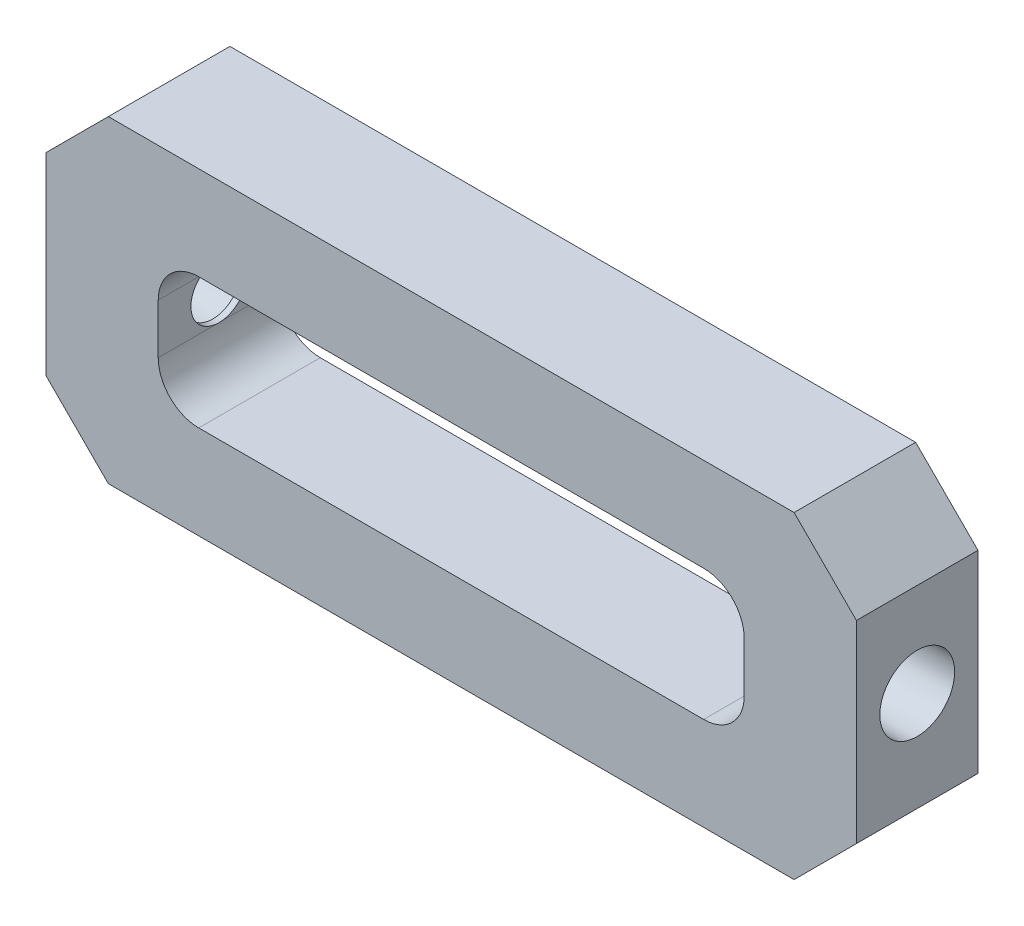
ISO-10303-21;
HEADER;
FILE_DESCRIPTION(('STEP AP214'),'2;1');
FILE_NAME('part.step','',(''),(''),'','','');
FILE_SCHEMA(('AUTOMOTIVE_DESIGN { 1 0 10303 214 1 1 1 1 }'));
ENDSEC;
DATA;
#1=APPLICATION_CONTEXT('core data for automotive mechanical design processes');
#2=APPLICATION_PROTOCOL_DEFINITION('international standard','automotive_design',2000,#1);
#3=PRODUCT_CONTEXT('',#1,'mechanical');
#4=PRODUCT('Part','Part','',(#3));
#5=PRODUCT_RELATED_PRODUCT_CATEGORY('part','',(#4));
#6=PRODUCT_DEFINITION_FORMATION('','',#4);
#7=PRODUCT_DEFINITION_CONTEXT('part definition',#1,'design');
#8=PRODUCT_DEFINITION('design','',#6,#7);
#9=PRODUCT_DEFINITION_SHAPE('','',#8);
#10=(LENGTH_UNIT() NAMED_UNIT(*) SI_UNIT(.MILLI.,.METRE.));
#11=(NAMED_UNIT(*) PLANE_ANGLE_UNIT() SI_UNIT($,.RADIAN.));
#12=(NAMED_UNIT(*) SI_UNIT($,.STERADIAN.) SOLID_ANGLE_UNIT());
#13=UNCERTAINTY_MEASURE_WITH_UNIT(LENGTH_MEASURE(1.E-05),#10,'distance_accuracy_value','');
#14=(GEOMETRIC_REPRESENTATION_CONTEXT(3) GLOBAL_UNCERTAINTY_ASSIGNED_CONTEXT((#13)) GLOBAL_UNIT_ASSIGNED_CONTEXT((#10,
#11,#12)) REPRESENTATION_CONTEXT('',''));
#15=CARTESIAN_POINT('',(0.,0.,0.));
#16=DIRECTION('',(0.,0.,1.));
#17=DIRECTION('',(1.,0.,0.));
#18=AXIS2_PLACEMENT_3D('',#15,#16,#17);
#19=CARTESIAN_POINT('',(130.,26.,9.75));
#20=DIRECTION('',(-1.,0.,0.));
#21=DIRECTION('',(0.,0.,1.));
#22=AXIS2_PLACEMENT_3D('',#19,#20,#21);
#23=CYLINDRICAL_SURFACE('',#22,4.5);
#24=CARTESIAN_POINT('',(112.,26.,9.75));
#25=DIRECTION('',(-1.,0.,0.));
#26=DIRECTION('',(0.,0.,1.));
#27=AXIS2_PLACEMENT_3D('',#24,#25,#26);
#28=CIRCLE('',#27,4.5);
#29=CARTESIAN_POINT('',(112.,29.5,6.92157287525381));
#30=VERTEX_POINT('',#29);
#31=CARTESIAN_POINT('',(112.,21.5,9.75));
#32=VERTEX_POINT('',#31);
#33=EDGE_CURVE('E326',#30,#32,#28,.T.);
#34=ORIENTED_EDGE('',*,*,#33,.T.);
#35=CARTESIAN_POINT('',(112.,29.5,12.5784271247462));
#36=VERTEX_POINT('',#35);
#37=EDGE_CURVE('E52',#32,#36,#28,.T.);
#38=ORIENTED_EDGE('',*,*,#37,.T.);
#39=CARTESIAN_POINT('',(112.,29.5,12.5784271247462));
#40=CARTESIAN_POINT('',(111.999991765271,29.5793480522933,12.4802609025094));
#41=CARTESIAN_POINT('',(111.998546501621,29.6545325897708,12.3787542444012));
#42=CARTESIAN_POINT('',(111.993641348599,29.7960835138657,12.1698415693693));
#43=CARTESIAN_POINT('',(111.990181874093,29.86245171292,12.0624367714046));
#44=CARTESIAN_POINT('',(111.982106767203,29.9859157819173,11.8424613735371));
#45=CARTESIAN_POINT('',(111.977491062238,30.0430110693938,11.7298904496996));
#46=CARTESIAN_POINT('',(111.967877834747,30.1475451558635,11.5003627214344));
#47=CARTESIAN_POINT('',(111.962880299963,30.1949836446903,11.383405776275));
#48=CARTESIAN_POINT('',(111.953186340534,30.2798799213596,11.1458990180754));
#49=CARTESIAN_POINT('',(111.948489943927,30.3173367808934,11.0253488720197));
#50=CARTESIAN_POINT('',(111.93996446048,30.3819992865734,10.7815000578609));
#51=CARTESIAN_POINT('',(111.936135363277,30.4092050552008,10.6582014226157));
#52=CARTESIAN_POINT('',(111.929774513598,30.4531491105912,10.4098160038804));
#53=CARTESIAN_POINT('',(111.927241769269,30.4698954021726,10.2847306629682));
#54=CARTESIAN_POINT('',(111.923739672502,30.4928261736446,10.033573653521));
#55=CARTESIAN_POINT('',(111.92277031047,30.499010718352,9.90750199104367));
#56=CARTESIAN_POINT('',(111.922496746255,30.5007678298603,9.65563441934543));
#57=CARTESIAN_POINT('',(111.923187912835,30.4963699112345,9.52983872032192));
#58=CARTESIAN_POINT('',(111.92615384106,30.4770576888269,9.279077271431));
#59=CARTESIAN_POINT('',(111.928428596322,30.4621434274301,9.15411151822064));
#60=CARTESIAN_POINT('',(111.934323779114,30.4218951409345,8.90579864913271));
#61=CARTESIAN_POINT('',(111.937945293265,30.3965527001796,8.7824529237898));
#62=CARTESIAN_POINT('',(111.946135168851,30.3356339670998,8.53834630347584));
#63=CARTESIAN_POINT('',(111.950703558956,30.3000573648869,8.41758548689424));
#64=CARTESIAN_POINT('',(111.960472569934,30.2170235996231,8.17391555679149));
#65=CARTESIAN_POINT('',(111.965692756131,30.1690890654669,8.05116963068393));
#66=CARTESIAN_POINT('',(111.975823377588,30.0626414924752,7.81034002006735));
#67=CARTESIAN_POINT('',(111.980733808297,30.0041282982344,7.6922564040808));
#68=CARTESIAN_POINT('',(111.989375845195,29.8769253786028,7.46159668903291));
#69=CARTESIAN_POINT('',(111.993107026541,29.8082319987049,7.3490225871752));
#70=CARTESIAN_POINT('',(111.998414272937,29.6612084587607,7.1302743477797));
#71=CARTESIAN_POINT('',(111.999989950695,29.5828765696692,7.02410136363859));
#72=CARTESIAN_POINT('',(112.,29.5,6.92157287525381));
#73=B_SPLINE_CURVE_WITH_KNOTS('',3,(#39,#40,#41,#42,#43,#44,#45,#46,#47,#48,#49,#50,#51,#52,#53,
#54,#55,#56,#57,#58,#59,#60,#61,#62,#63,#64,#65,#66,#67,#68,#69,#70,#71,#72),.UNSPECIFIED.,.F.,
.F.,(4,2,2,2,2,2,2,2,2,2,2,2,2,2,2,2,4),(0.,0.378527917309161,0.75697789714145,1.13545163965585,
1.5139375364342,1.89245862077817,2.27097518237082,2.64920170259913,3.02742590166147,
3.40459645370172,3.78176548560303,4.15923949590161,4.53672493723316,4.93184501737969,
5.32697090248861,5.72223897596385,6.11757805995332),.UNSPECIFIED.);
#74=EDGE_CURVE('E183',#36,#30,#73,.T.);
#75=ORIENTED_EDGE('',*,*,#74,.T.);
#76=EDGE_LOOP('',(#34,#38,#75));
#77=FACE_BOUND('',#76,.T.);
#78=CARTESIAN_POINT('',(120.,26.,9.75));
#79=DIRECTION('',(1.,0.,0.));
#80=DIRECTION('',(0.,0.,-1.));
#81=AXIS2_PLACEMENT_3D('',#78,#79,#80);
#82=CIRCLE('',#81,4.5);
#83=CARTESIAN_POINT('',(120.,26.,5.25));
#84=VERTEX_POINT('',#83);
#85=EDGE_CURVE('E39',#84,#84,#82,.F.);
#86=ORIENTED_EDGE('',*,*,#85,.F.);
#87=EDGE_LOOP('',(#86));
#88=FACE_BOUND('',#87,.T.);
#89=ADVANCED_FACE('F35',(#77,#88),#23,.F.);
#90=CARTESIAN_POINT('',(18.,29.5,6.92157287525381));
#91=CARTESIAN_POINT('',(18.000008234729,29.5793480522933,7.01973909749057));
#92=CARTESIAN_POINT('',(18.0014534983789,29.6545325897708,7.12124575559876));
#93=CARTESIAN_POINT('',(18.0063586514006,29.7960835138657,7.33015843063067));
#94=CARTESIAN_POINT('',(18.0098181259073,29.86245171292,7.43756322859537));
#95=CARTESIAN_POINT('',(18.0178932327974,29.9859157819173,7.65753862646291));
#96=CARTESIAN_POINT('',(18.0225089377619,30.0430110693938,7.77010955030039));
#97=CARTESIAN_POINT('',(18.0321221652533,30.1475451558635,7.99963727856562));
#98=CARTESIAN_POINT('',(18.0371197000371,30.1949836446903,8.11659422372496));
#99=CARTESIAN_POINT('',(18.0468136594657,30.2798799213596,8.35410098192457));
#100=CARTESIAN_POINT('',(18.0515100560731,30.3173367808934,8.47465112798033));
#101=CARTESIAN_POINT('',(18.0600355395204,30.3819992865734,8.71849994213914));
#102=CARTESIAN_POINT('',(18.0638646367226,30.4092050552008,8.84179857738433));
#103=CARTESIAN_POINT('',(18.0702254864016,30.4531491105912,9.09018399611962));
#104=CARTESIAN_POINT('',(18.072758230731,30.4698954021726,9.21526933703175));
#105=CARTESIAN_POINT('',(18.0762603274978,30.4928261736446,9.466426346479));
#106=CARTESIAN_POINT('',(18.0772296895296,30.499010718352,9.59249800895633));
#107=CARTESIAN_POINT('',(18.0775032537455,30.5007678298603,9.84436558065457));
#108=CARTESIAN_POINT('',(18.0768120871652,30.4963699112345,9.97016127967808));
#109=CARTESIAN_POINT('',(18.07384615894,30.4770576888269,10.220922728569));
#110=CARTESIAN_POINT('',(18.0715714036776,30.4621434274301,10.3458884817794));
#111=CARTESIAN_POINT('',(18.0656762208859,30.4218951409345,10.5942013508673));
#112=CARTESIAN_POINT('',(18.0620547067351,30.3965527001796,10.7175470762102));
#113=CARTESIAN_POINT('',(18.0538648311493,30.3356339670998,10.9616536965242));
#114=CARTESIAN_POINT('',(18.0492964410443,30.3000573648869,11.0824145131058));
#115=CARTESIAN_POINT('',(18.0395274300662,30.2170235996231,11.3260844432085));
#116=CARTESIAN_POINT('',(18.0343072438692,30.1690890654669,11.4488303693161));
#117=CARTESIAN_POINT('',(18.0241766224116,30.0626414924752,11.6896599799327));
#118=CARTESIAN_POINT('',(18.0192661917029,30.0041282982344,11.8077435959192));
#119=CARTESIAN_POINT('',(18.0106241548051,29.8769253786028,12.0384033109671));
#120=CARTESIAN_POINT('',(18.0068929734587,29.8082319987049,12.1509774128248));
#121=CARTESIAN_POINT('',(18.0015857270633,29.6612084587607,12.3697256522203));
#122=CARTESIAN_POINT('',(18.0000100493046,29.5828765696692,12.4758986363614));
#123=CARTESIAN_POINT('',(18.,29.5,12.5784271247462));
#124=B_SPLINE_CURVE_WITH_KNOTS('',3,(#90,#91,#92,#93,#94,#95,#96,#97,#98,#99,#100,#101,#102,
#103,#104,#105,#106,#107,#108,#109,#110,#111,#112,#113,#114,#115,#116,#117,#118,#119,#120,#121,
#122,#123),.UNSPECIFIED.,.F.,.F.,(4,2,2,2,2,2,2,2,2,2,2,2,2,2,2,2,4),(0.,0.378527917309161,
0.756977897141452,1.13545163965585,1.5139375364342,1.89245862077817,2.27097518237082,
2.64920170259913,3.02742590166147,3.40459645370172,3.78176548560303,4.1592394959016,
4.53672493723316,4.93184501737969,5.32697090248861,5.72223897596385,6.11757805995332),.UNSPECIFIED.);
#125=CARTESIAN_POINT('',(18.,29.5,6.92157287525381));
#126=VERTEX_POINT('',#125);
#127=CARTESIAN_POINT('',(18.,29.5,12.5784271247462));
#128=VERTEX_POINT('',#127);
#129=EDGE_CURVE('E169',#126,#128,#124,.T.);
#130=ORIENTED_EDGE('',*,*,#129,.T.);
#131=CARTESIAN_POINT('',(18.,26.,9.75));
#132=DIRECTION('',(1.,0.,0.));
#133=DIRECTION('',(0.,0.,-1.));
#134=AXIS2_PLACEMENT_3D('',#131,#132,#133);
#135=CIRCLE('',#134,4.5);
#136=CARTESIAN_POINT('',(18.,21.5,9.75));
#137=VERTEX_POINT('',#136);
#138=EDGE_CURVE('E60',#128,#137,#135,.T.);
#139=ORIENTED_EDGE('',*,*,#138,.T.);
#140=EDGE_CURVE('E165',#137,#126,#135,.T.);
#141=ORIENTED_EDGE('',*,*,#140,.T.);
#142=EDGE_LOOP('',(#130,#139,#141));
#143=FACE_BOUND('',#142,.T.);
#144=CARTESIAN_POINT('',(17.,26.,9.75));
#145=DIRECTION('',(-1.,0.,0.));
#146=DIRECTION('',(0.,0.,1.));
#147=AXIS2_PLACEMENT_3D('',#144,#145,#146);
#148=CIRCLE('',#147,4.5);
#149=CARTESIAN_POINT('',(17.,26.,14.25));
#150=VERTEX_POINT('',#149);
#151=EDGE_CURVE('E173',#150,#150,#148,.F.);
#152=ORIENTED_EDGE('',*,*,#151,.F.);
#153=EDGE_LOOP('',(#152));
#154=FACE_BOUND('',#153,.T.);
#155=ADVANCED_FACE('F167',(#143,#154),#23,.F.);
#156=CARTESIAN_POINT('',(112.,29.5,19.5));
#157=DIRECTION('',(-1.,0.,0.));
#158=DIRECTION('',(0.,0.,1.));
#159=AXIS2_PLACEMENT_3D('',#156,#157,#158);
#160=PLANE('',#159);
#161=ORIENTED_EDGE('',*,*,#33,.F.);
#162=DIRECTION('',(0.,0.,-1.));
#163=VECTOR('',#162,1.);
#164=CARTESIAN_POINT('',(112.,29.5,19.5));
#165=LINE('',#164,#163);
#166=CARTESIAN_POINT('',(112.,29.5,0.));
#167=VERTEX_POINT('',#166);
#168=EDGE_CURVE('E200',#30,#167,#165,.T.);
#169=ORIENTED_EDGE('',*,*,#168,.T.);
#170=DIRECTION('',(0.,1.,0.));
#171=VECTOR('',#170,1.);
#172=CARTESIAN_POINT('',(112.,29.5,0.));
#173=LINE('',#172,#171);
#174=CARTESIAN_POINT('',(112.,21.5,0.));
#175=VERTEX_POINT('',#174);
#176=EDGE_CURVE('E442',#175,#167,#173,.T.);
#177=ORIENTED_EDGE('',*,*,#176,.F.);
#178=DIRECTION('',(0.,0.,-1.));
#179=VECTOR('',#178,1.);
#180=CARTESIAN_POINT('',(112.,21.5,19.5));
#181=LINE('',#180,#179);
#182=EDGE_CURVE('E204',#32,#175,#181,.T.);
#183=ORIENTED_EDGE('',*,*,#182,.F.);
#184=EDGE_LOOP('',(#161,#169,#177,#183));
#185=FACE_BOUND('',#184,.T.);
#186=ADVANCED_FACE('F300',(#185),#160,.T.);
#187=CARTESIAN_POINT('',(18.,29.5,19.5));
#188=DIRECTION('',(1.,0.,0.));
#189=DIRECTION('',(0.,0.,-1.));
#190=AXIS2_PLACEMENT_3D('',#187,#188,#189);
#191=PLANE('',#190);
#192=ORIENTED_EDGE('',*,*,#138,.F.);
#193=DIRECTION('',(0.,0.,-1.));
#194=VECTOR('',#193,1.);
#195=CARTESIAN_POINT('',(18.,29.5,19.5));
#196=LINE('',#195,#194);
#197=CARTESIAN_POINT('',(18.,29.5,19.5));
#198=VERTEX_POINT('',#197);
#199=EDGE_CURVE('E182',#198,#128,#196,.T.);
#200=ORIENTED_EDGE('',*,*,#199,.F.);
#201=DIRECTION('',(0.,-1.,0.));
#202=VECTOR('',#201,1.);
#203=CARTESIAN_POINT('',(18.,29.5,19.5));
#204=LINE('',#203,#202);
#205=CARTESIAN_POINT('',(18.,21.5,19.5));
#206=VERTEX_POINT('',#205);
#207=EDGE_CURVE('E470',#198,#206,#204,.T.);
#208=ORIENTED_EDGE('',*,*,#207,.T.);
#209=DIRECTION('',(0.,0.,-1.));
#210=VECTOR('',#209,1.);
#211=CARTESIAN_POINT('',(18.,21.5,19.5));
#212=LINE('',#211,#210);
#213=EDGE_CURVE('E189',#206,#137,#212,.T.);
#214=ORIENTED_EDGE('',*,*,#213,.T.);
#215=EDGE_LOOP('',(#192,#200,#208,#214));
#216=FACE_BOUND('',#215,.T.);
#217=ADVANCED_FACE('F313',(#216),#191,.T.);
#218=CARTESIAN_POINT('',(0.,0.,19.5));
#219=DIRECTION('',(0.,0.,1.));
#220=DIRECTION('',(1.,0.,0.));
#221=AXIS2_PLACEMENT_3D('',#218,#219,#220);
#222=PLANE('',#221);
#223=DIRECTION('',(-0.707106781186547,-0.707106781186548,0.));
#224=VECTOR('',#223,1.);
#225=CARTESIAN_POINT('',(0.,41.,19.5));
#226=LINE('',#225,#224);
#227=CARTESIAN_POINT('',(10.,51.,19.5));
#228=VERTEX_POINT('',#227);
#229=CARTESIAN_POINT('',(0.,41.,19.5));
#230=VERTEX_POINT('',#229);
#231=EDGE_CURVE('E214',#228,#230,#226,.T.);
#232=ORIENTED_EDGE('',*,*,#231,.T.);
#233=DIRECTION('',(0.,-1.,0.));
#234=VECTOR('',#233,1.);
#235=CARTESIAN_POINT('',(0.,41.,19.5));
#236=LINE('',#235,#234);
#237=CARTESIAN_POINT('',(0.,10.,19.5));
#238=VERTEX_POINT('',#237);
#239=EDGE_CURVE('E217',#230,#238,#236,.T.);
#240=ORIENTED_EDGE('',*,*,#239,.T.);
#241=DIRECTION('',(0.707106781186548,-0.707106781186548,0.));
#242=VECTOR('',#241,1.);
#243=CARTESIAN_POINT('',(0.,10.,19.5));
#244=LINE('',#243,#242);
#245=CARTESIAN_POINT('',(10.,0.,19.5));
#246=VERTEX_POINT('',#245);
#247=EDGE_CURVE('E220',#238,#246,#244,.T.);
#248=ORIENTED_EDGE('',*,*,#247,.T.);
#249=DIRECTION('',(1.,0.,0.));
#250=VECTOR('',#249,1.);
#251=CARTESIAN_POINT('',(10.,0.,19.5));
#252=LINE('',#251,#250);
#253=CARTESIAN_POINT('',(120.,0.,19.5));
#254=VERTEX_POINT('',#253);
#255=EDGE_CURVE('E222',#246,#254,#252,.T.);
#256=ORIENTED_EDGE('',*,*,#255,.T.);
#257=DIRECTION('',(0.707106781186548,0.707106781186547,0.));
#258=VECTOR('',#257,1.);
#259=CARTESIAN_POINT('',(130.,10.,19.5));
#260=LINE('',#259,#258);
#261=CARTESIAN_POINT('',(130.,10.,19.5));
#262=VERTEX_POINT('',#261);
#263=EDGE_CURVE('E224',#254,#262,#260,.T.);
#264=ORIENTED_EDGE('',*,*,#263,.T.);
#265=DIRECTION('',(0.,1.,0.));
#266=VECTOR('',#265,1.);
#267=CARTESIAN_POINT('',(130.,41.,19.5));
#268=LINE('',#267,#266);
#269=CARTESIAN_POINT('',(130.,41.,19.5));
#270=VERTEX_POINT('',#269);
#271=EDGE_CURVE('E226',#262,#270,#268,.T.);
#272=ORIENTED_EDGE('',*,*,#271,.T.);
#273=DIRECTION('',(-0.707106781186548,0.707106781186547,0.));
#274=VECTOR('',#273,1.);
#275=CARTESIAN_POINT('',(130.,41.,19.5));
#276=LINE('',#275,#274);
#277=CARTESIAN_POINT('',(120.,51.,19.5));
#278=VERTEX_POINT('',#277);
#279=EDGE_CURVE('E228',#270,#278,#276,.T.);
#280=ORIENTED_EDGE('',*,*,#279,.T.);
#281=DIRECTION('',(-1.,0.,0.));
#282=VECTOR('',#281,1.);
#283=CARTESIAN_POINT('',(10.,51.,19.5));
#284=LINE('',#283,#282);
#285=EDGE_CURVE('E230',#278,#228,#284,.T.);
#286=ORIENTED_EDGE('',*,*,#285,.T.);
#287=EDGE_LOOP('',(#232,#240,#248,#256,#264,#272,#280,#286));
#288=FACE_BOUND('',#287,.T.);
#289=DIRECTION('',(1.,0.,0.));
#290=VECTOR('',#289,1.);
#291=CARTESIAN_POINT('',(24.5,15.,19.5));
#292=LINE('',#291,#290);
#293=CARTESIAN_POINT('',(24.5,15.,19.5));
#294=VERTEX_POINT('',#293);
#295=CARTESIAN_POINT('',(105.5,15.,19.5));
#296=VERTEX_POINT('',#295);
#297=EDGE_CURVE('E450',#294,#296,#292,.T.);
#298=ORIENTED_EDGE('',*,*,#297,.F.);
#299=CARTESIAN_POINT('',(24.5,21.5,19.5));
#300=DIRECTION('',(0.,0.,1.));
#301=DIRECTION('',(1.,0.,0.));
#302=AXIS2_PLACEMENT_3D('',#299,#300,#301);
#303=CIRCLE('',#302,6.5);
#304=EDGE_CURVE('E449',#206,#294,#303,.T.);
#305=ORIENTED_EDGE('',*,*,#304,.F.);
#306=ORIENTED_EDGE('',*,*,#207,.F.);
#307=CARTESIAN_POINT('',(24.5,29.5,19.5));
#308=DIRECTION('',(0.,0.,1.));
#309=DIRECTION('',(1.,0.,0.));
#310=AXIS2_PLACEMENT_3D('',#307,#308,#309);
#311=CIRCLE('',#310,6.5);
#312=CARTESIAN_POINT('',(24.5,36.,19.5));
#313=VERTEX_POINT('',#312);
#314=EDGE_CURVE('E468',#313,#198,#311,.T.);
#315=ORIENTED_EDGE('',*,*,#314,.F.);
#316=DIRECTION('',(-1.,0.,0.));
#317=VECTOR('',#316,1.);
#318=CARTESIAN_POINT('',(24.5,36.,19.5));
#319=LINE('',#318,#317);
#320=CARTESIAN_POINT('',(105.5,36.,19.5));
#321=VERTEX_POINT('',#320);
#322=EDGE_CURVE('E466',#321,#313,#319,.T.);
#323=ORIENTED_EDGE('',*,*,#322,.F.);
#324=CARTESIAN_POINT('',(105.5,29.5,19.5));
#325=DIRECTION('',(0.,0.,1.));
#326=DIRECTION('',(1.,0.,0.));
#327=AXIS2_PLACEMENT_3D('',#324,#325,#326);
#328=CIRCLE('',#327,6.5);
#329=CARTESIAN_POINT('',(112.,29.5,19.5));
#330=VERTEX_POINT('',#329);
#331=EDGE_CURVE('E464',#330,#321,#328,.T.);
#332=ORIENTED_EDGE('',*,*,#331,.F.);
#333=DIRECTION('',(0.,1.,0.));
#334=VECTOR('',#333,1.);
#335=CARTESIAN_POINT('',(112.,29.5,19.5));
#336=LINE('',#335,#334);
#337=CARTESIAN_POINT('',(112.,21.5,19.5));
#338=VERTEX_POINT('',#337);
#339=EDGE_CURVE('E462',#338,#330,#336,.T.);
#340=ORIENTED_EDGE('',*,*,#339,.F.);
#341=CARTESIAN_POINT('',(105.5,21.5,19.5));
#342=DIRECTION('',(0.,0.,1.));
#343=DIRECTION('',(1.,0.,0.));
#344=AXIS2_PLACEMENT_3D('',#341,#342,#343);
#345=CIRCLE('',#344,6.50000000000002);
#346=EDGE_CURVE('E455',#296,#338,#345,.T.);
#347=ORIENTED_EDGE('',*,*,#346,.F.);
#348=EDGE_LOOP('',(#298,#305,#306,#315,#323,#332,#340,#347));
#349=FACE_BOUND('',#348,.T.);
#350=ADVANCED_FACE('F319',(#288,#349),#222,.T.);
#351=CARTESIAN_POINT('',(0.,0.,0.));
#352=DIRECTION('',(0.,0.,1.));
#353=DIRECTION('',(1.,0.,0.));
#354=AXIS2_PLACEMENT_3D('',#351,#352,#353);
#355=PLANE('',#354);
#356=DIRECTION('',(-0.707106781186547,-0.707106781186548,0.));
#357=VECTOR('',#356,1.);
#358=CARTESIAN_POINT('',(0.,41.,0.));
#359=LINE('',#358,#357);
#360=CARTESIAN_POINT('',(10.,51.,0.));
#361=VERTEX_POINT('',#360);
#362=CARTESIAN_POINT('',(0.,41.,0.));
#363=VERTEX_POINT('',#362);
#364=EDGE_CURVE('E213',#361,#363,#359,.T.);
#365=ORIENTED_EDGE('',*,*,#364,.F.);
#366=DIRECTION('',(-1.,0.,0.));
#367=VECTOR('',#366,1.);
#368=CARTESIAN_POINT('',(10.,51.,0.));
#369=LINE('',#368,#367);
#370=CARTESIAN_POINT('',(120.,51.,0.));
#371=VERTEX_POINT('',#370);
#372=EDGE_CURVE('E218',#371,#361,#369,.T.);
#373=ORIENTED_EDGE('',*,*,#372,.F.);
#374=DIRECTION('',(-0.707106781186548,0.707106781186547,0.));
#375=VECTOR('',#374,1.);
#376=CARTESIAN_POINT('',(130.,41.,0.));
#377=LINE('',#376,#375);
#378=CARTESIAN_POINT('',(130.,41.,0.));
#379=VERTEX_POINT('',#378);
#380=EDGE_CURVE('E245',#379,#371,#377,.T.);
#381=ORIENTED_EDGE('',*,*,#380,.F.);
#382=DIRECTION('',(0.,1.,0.));
#383=VECTOR('',#382,1.);
#384=CARTESIAN_POINT('',(130.,41.,0.));
#385=LINE('',#384,#383);
#386=CARTESIAN_POINT('',(130.,10.,0.));
#387=VERTEX_POINT('',#386);
#388=EDGE_CURVE('E243',#387,#379,#385,.T.);
#389=ORIENTED_EDGE('',*,*,#388,.F.);
#390=DIRECTION('',(0.707106781186548,0.707106781186547,0.));
#391=VECTOR('',#390,1.);
#392=CARTESIAN_POINT('',(130.,10.,0.));
#393=LINE('',#392,#391);
#394=CARTESIAN_POINT('',(120.,0.,0.));
#395=VERTEX_POINT('',#394);
#396=EDGE_CURVE('E241',#395,#387,#393,.T.);
#397=ORIENTED_EDGE('',*,*,#396,.F.);
#398=DIRECTION('',(1.,0.,0.));
#399=VECTOR('',#398,1.);
#400=CARTESIAN_POINT('',(10.,0.,0.));
#401=LINE('',#400,#399);
#402=CARTESIAN_POINT('',(10.,0.,0.));
#403=VERTEX_POINT('',#402);
#404=EDGE_CURVE('E239',#403,#395,#401,.T.);
#405=ORIENTED_EDGE('',*,*,#404,.F.);
#406=DIRECTION('',(0.707106781186548,-0.707106781186548,0.));
#407=VECTOR('',#406,1.);
#408=CARTESIAN_POINT('',(0.,10.,0.));
#409=LINE('',#408,#407);
#410=CARTESIAN_POINT('',(0.,10.,0.));
#411=VERTEX_POINT('',#410);
#412=EDGE_CURVE('E237',#411,#403,#409,.T.);
#413=ORIENTED_EDGE('',*,*,#412,.F.);
#414=DIRECTION('',(0.,-1.,0.));
#415=VECTOR('',#414,1.);
#416=CARTESIAN_POINT('',(0.,41.,0.));
#417=LINE('',#416,#415);
#418=EDGE_CURVE('E235',#363,#411,#417,.T.);
#419=ORIENTED_EDGE('',*,*,#418,.F.);
#420=EDGE_LOOP('',(#365,#373,#381,#389,#397,#405,#413,#419));
#421=FACE_BOUND('',#420,.T.);
#422=CARTESIAN_POINT('',(24.5,21.5,0.));
#423=DIRECTION('',(0.,0.,1.));
#424=DIRECTION('',(1.,0.,0.));
#425=AXIS2_PLACEMENT_3D('',#422,#423,#424);
#426=CIRCLE('',#425,6.5);
#427=CARTESIAN_POINT('',(18.,21.5,0.));
#428=VERTEX_POINT('',#427);
#429=CARTESIAN_POINT('',(24.5,15.,0.));
#430=VERTEX_POINT('',#429);
#431=EDGE_CURVE('E472',#428,#430,#426,.T.);
#432=ORIENTED_EDGE('',*,*,#431,.T.);
#433=DIRECTION('',(1.,0.,0.));
#434=VECTOR('',#433,1.);
#435=CARTESIAN_POINT('',(24.5,15.,0.));
#436=LINE('',#435,#434);
#437=CARTESIAN_POINT('',(105.5,15.,0.));
#438=VERTEX_POINT('',#437);
#439=EDGE_CURVE('E474',#430,#438,#436,.T.);
#440=ORIENTED_EDGE('',*,*,#439,.T.);
#441=CARTESIAN_POINT('',(105.5,21.5,0.));
#442=DIRECTION('',(0.,0.,1.));
#443=DIRECTION('',(1.,0.,0.));
#444=AXIS2_PLACEMENT_3D('',#441,#442,#443);
#445=CIRCLE('',#444,6.50000000000002);
#446=EDGE_CURVE('E445',#438,#175,#445,.T.);
#447=ORIENTED_EDGE('',*,*,#446,.T.);
#448=ORIENTED_EDGE('',*,*,#176,.T.);
#449=CARTESIAN_POINT('',(105.5,29.5,0.));
#450=DIRECTION('',(0.,0.,1.));
#451=DIRECTION('',(1.,0.,0.));
#452=AXIS2_PLACEMENT_3D('',#449,#450,#451);
#453=CIRCLE('',#452,6.5);
#454=CARTESIAN_POINT('',(105.5,36.,0.));
#455=VERTEX_POINT('',#454);
#456=EDGE_CURVE('E435',#167,#455,#453,.T.);
#457=ORIENTED_EDGE('',*,*,#456,.T.);
#458=DIRECTION('',(-1.,0.,0.));
#459=VECTOR('',#458,1.);
#460=CARTESIAN_POINT('',(24.5,36.,0.));
#461=LINE('',#460,#459);
#462=CARTESIAN_POINT('',(24.5,36.,0.));
#463=VERTEX_POINT('',#462);
#464=EDGE_CURVE('E430',#455,#463,#461,.T.);
#465=ORIENTED_EDGE('',*,*,#464,.T.);
#466=CARTESIAN_POINT('',(24.5,29.5,0.));
#467=DIRECTION('',(0.,0.,1.));
#468=DIRECTION('',(1.,0.,0.));
#469=AXIS2_PLACEMENT_3D('',#466,#467,#468);
#470=CIRCLE('',#469,6.5);
#471=CARTESIAN_POINT('',(18.,29.5,0.));
#472=VERTEX_POINT('',#471);
#473=EDGE_CURVE('E434',#463,#472,#470,.T.);
#474=ORIENTED_EDGE('',*,*,#473,.T.);
#475=DIRECTION('',(0.,-1.,0.));
#476=VECTOR('',#475,1.);
#477=CARTESIAN_POINT('',(18.,29.5,0.));
#478=LINE('',#477,#476);
#479=EDGE_CURVE('E187',#472,#428,#478,.T.);
#480=ORIENTED_EDGE('',*,*,#479,.T.);
#481=EDGE_LOOP('',(#432,#440,#447,#448,#457,#465,#474,#480));
#482=FACE_BOUND('',#481,.T.);
#483=ADVANCED_FACE('F357',(#421,#482),#355,.F.);
#484=CARTESIAN_POINT('',(0.,41.,19.5));
#485=DIRECTION('',(0.707106781186548,-0.707106781186547,0.));
#486=DIRECTION('',(0.707106781186547,0.707106781186548,0.));
#487=AXIS2_PLACEMENT_3D('',#484,#485,#486);
#488=PLANE('',#487);
#489=ORIENTED_EDGE('',*,*,#364,.T.);
#490=DIRECTION('',(0.,0.,-1.));
#491=VECTOR('',#490,1.);
#492=CARTESIAN_POINT('',(0.,41.,19.5));
#493=LINE('',#492,#491);
#494=EDGE_CURVE('E11',#230,#363,#493,.T.);
#495=ORIENTED_EDGE('',*,*,#494,.F.);
#496=ORIENTED_EDGE('',*,*,#231,.F.);
#497=DIRECTION('',(0.,0.,-1.));
#498=VECTOR('',#497,1.);
#499=CARTESIAN_POINT('',(10.,51.,19.5));
#500=LINE('',#499,#498);
#501=EDGE_CURVE('E232',#228,#361,#500,.T.);
#502=ORIENTED_EDGE('',*,*,#501,.T.);
#503=EDGE_LOOP('',(#489,#495,#496,#502));
#504=FACE_BOUND('',#503,.T.);
#505=ADVANCED_FACE('F37',(#504),#488,.F.);
#506=CARTESIAN_POINT('',(0.,41.,19.5));
#507=DIRECTION('',(1.,0.,0.));
#508=DIRECTION('',(0.,0.,-1.));
#509=AXIS2_PLACEMENT_3D('',#506,#507,#508);
#510=PLANE('',#509);
#511=CARTESIAN_POINT('',(0.,26.,9.75));
#512=DIRECTION('',(-1.,0.,0.));
#513=DIRECTION('',(0.,0.,1.));
#514=AXIS2_PLACEMENT_3D('',#511,#512,#513);
#515=CIRCLE('',#514,8.5);
#516=CARTESIAN_POINT('',(0.,26.,18.25));
#517=VERTEX_POINT('',#516);
#518=EDGE_CURVE('E458',#517,#517,#515,.T.);
#519=ORIENTED_EDGE('',*,*,#518,.F.);
#520=EDGE_LOOP('',(#519));
#521=FACE_BOUND('',#520,.T.);
#522=ORIENTED_EDGE('',*,*,#418,.T.);
#523=DIRECTION('',(0.,0.,-1.));
#524=VECTOR('',#523,1.);
#525=CARTESIAN_POINT('',(0.,10.,19.5));
#526=LINE('',#525,#524);
#527=EDGE_CURVE('E44',#238,#411,#526,.T.);
#528=ORIENTED_EDGE('',*,*,#527,.F.);
#529=ORIENTED_EDGE('',*,*,#239,.F.);
#530=ORIENTED_EDGE('',*,*,#494,.T.);
#531=EDGE_LOOP('',(#522,#528,#529,#530));
#532=FACE_BOUND('',#531,.T.);
#533=ADVANCED_FACE('F382',(#521,#532),#510,.F.);
#534=CARTESIAN_POINT('',(0.,10.,19.5));
#535=DIRECTION('',(0.707106781186548,0.707106781186548,0.));
#536=DIRECTION('',(-0.707106781186548,0.707106781186548,0.));
#537=AXIS2_PLACEMENT_3D('',#534,#535,#536);
#538=PLANE('',#537);
#539=ORIENTED_EDGE('',*,*,#412,.T.);
#540=DIRECTION('',(0.,0.,-1.));
#541=VECTOR('',#540,1.);
#542=CARTESIAN_POINT('',(10.,0.,19.5));
#543=LINE('',#542,#541);
#544=EDGE_CURVE('E262',#246,#403,#543,.T.);
#545=ORIENTED_EDGE('',*,*,#544,.F.);
#546=ORIENTED_EDGE('',*,*,#247,.F.);
#547=ORIENTED_EDGE('',*,*,#527,.T.);
#548=EDGE_LOOP('',(#539,#545,#546,#547));
#549=FACE_BOUND('',#548,.T.);
#550=ADVANCED_FACE('F380',(#549),#538,.F.);
#551=CARTESIAN_POINT('',(10.,0.,19.5));
#552=DIRECTION('',(0.,1.,0.));
#553=DIRECTION('',(0.,0.,1.));
#554=AXIS2_PLACEMENT_3D('',#551,#552,#553);
#555=PLANE('',#554);
#556=ORIENTED_EDGE('',*,*,#404,.T.);
#557=DIRECTION('',(0.,0.,-1.));
#558=VECTOR('',#557,1.);
#559=CARTESIAN_POINT('',(120.,0.,19.5));
#560=LINE('',#559,#558);
#561=EDGE_CURVE('E259',#254,#395,#560,.T.);
#562=ORIENTED_EDGE('',*,*,#561,.F.);
#563=ORIENTED_EDGE('',*,*,#255,.F.);
#564=ORIENTED_EDGE('',*,*,#544,.T.);
#565=EDGE_LOOP('',(#556,#562,#563,#564));
#566=FACE_BOUND('',#565,.T.);
#567=ADVANCED_FACE('F376',(#566),#555,.F.);
#568=CARTESIAN_POINT('',(130.,10.,19.5));
#569=DIRECTION('',(-0.707106781186547,0.707106781186548,0.));
#570=DIRECTION('',(-0.707106781186548,-0.707106781186547,0.));
#571=AXIS2_PLACEMENT_3D('',#568,#569,#570);
#572=PLANE('',#571);
#573=ORIENTED_EDGE('',*,*,#396,.T.);
#574=DIRECTION('',(0.,0.,-1.));
#575=VECTOR('',#574,1.);
#576=CARTESIAN_POINT('',(130.,10.,19.5));
#577=LINE('',#576,#575);
#578=EDGE_CURVE('E256',#262,#387,#577,.T.);
#579=ORIENTED_EDGE('',*,*,#578,.F.);
#580=ORIENTED_EDGE('',*,*,#263,.F.);
#581=ORIENTED_EDGE('',*,*,#561,.T.);
#582=EDGE_LOOP('',(#573,#579,#580,#581));
#583=FACE_BOUND('',#582,.T.);
#584=ADVANCED_FACE('F343',(#583),#572,.F.);
#585=CARTESIAN_POINT('',(130.,41.,19.5));
#586=DIRECTION('',(-1.,0.,0.));
#587=DIRECTION('',(0.,0.,1.));
#588=AXIS2_PLACEMENT_3D('',#585,#586,#587);
#589=PLANE('',#588);
#590=CARTESIAN_POINT('',(130.,26.,9.75));
#591=DIRECTION('',(1.,0.,0.));
#592=DIRECTION('',(0.,0.,-1.));
#593=AXIS2_PLACEMENT_3D('',#590,#591,#592);
#594=CIRCLE('',#593,6.);
#595=CARTESIAN_POINT('',(130.,26.,3.75));
#596=VERTEX_POINT('',#595);
#597=EDGE_CURVE('E278',#596,#596,#594,.T.);
#598=ORIENTED_EDGE('',*,*,#597,.F.);
#599=EDGE_LOOP('',(#598));
#600=FACE_BOUND('',#599,.T.);
#601=ORIENTED_EDGE('',*,*,#388,.T.);
#602=DIRECTION('',(0.,0.,-1.));
#603=VECTOR('',#602,1.);
#604=CARTESIAN_POINT('',(130.,41.,19.5));
#605=LINE('',#604,#603);
#606=EDGE_CURVE('E253',#270,#379,#605,.T.);
#607=ORIENTED_EDGE('',*,*,#606,.F.);
#608=ORIENTED_EDGE('',*,*,#271,.F.);
#609=ORIENTED_EDGE('',*,*,#578,.T.);
#610=EDGE_LOOP('',(#601,#607,#608,#609));
#611=FACE_BOUND('',#610,.T.);
#612=ADVANCED_FACE('F339',(#600,#611),#589,.F.);
#613=CARTESIAN_POINT('',(130.,41.,19.5));
#614=DIRECTION('',(-0.707106781186547,-0.707106781186548,0.));
#615=DIRECTION('',(0.707106781186548,-0.707106781186547,0.));
#616=AXIS2_PLACEMENT_3D('',#613,#614,#615);
#617=PLANE('',#616);
#618=ORIENTED_EDGE('',*,*,#380,.T.);
#619=DIRECTION('',(0.,0.,-1.));
#620=VECTOR('',#619,1.);
#621=CARTESIAN_POINT('',(120.,51.,19.5));
#622=LINE('',#621,#620);
#623=EDGE_CURVE('E250',#278,#371,#622,.T.);
#624=ORIENTED_EDGE('',*,*,#623,.F.);
#625=ORIENTED_EDGE('',*,*,#279,.F.);
#626=ORIENTED_EDGE('',*,*,#606,.T.);
#627=EDGE_LOOP('',(#618,#624,#625,#626));
#628=FACE_BOUND('',#627,.T.);
#629=ADVANCED_FACE('F342',(#628),#617,.F.);
#630=CARTESIAN_POINT('',(10.,51.,19.5));
#631=DIRECTION('',(0.,-1.,0.));
#632=DIRECTION('',(0.,0.,-1.));
#633=AXIS2_PLACEMENT_3D('',#630,#631,#632);
#634=PLANE('',#633);
#635=ORIENTED_EDGE('',*,*,#372,.T.);
#636=ORIENTED_EDGE('',*,*,#501,.F.);
#637=ORIENTED_EDGE('',*,*,#285,.F.);
#638=ORIENTED_EDGE('',*,*,#623,.T.);
#639=EDGE_LOOP('',(#635,#636,#637,#638));
#640=FACE_BOUND('',#639,.T.);
#641=ADVANCED_FACE('F361',(#640),#634,.F.);
#642=CARTESIAN_POINT('',(24.5,21.5,19.5));
#643=DIRECTION('',(0.,0.,-1.));
#644=DIRECTION('',(-1.,0.,0.));
#645=AXIS2_PLACEMENT_3D('',#642,#643,#644);
#646=CYLINDRICAL_SURFACE('',#645,6.5);
#647=ORIENTED_EDGE('',*,*,#431,.F.);
#648=EDGE_CURVE('E193',#137,#428,#212,.T.);
#649=ORIENTED_EDGE('',*,*,#648,.F.);
#650=ORIENTED_EDGE('',*,*,#213,.F.);
#651=ORIENTED_EDGE('',*,*,#304,.T.);
#652=DIRECTION('',(0.,0.,-1.));
#653=VECTOR('',#652,1.);
#654=CARTESIAN_POINT('',(24.5,15.,19.5));
#655=LINE('',#654,#653);
#656=EDGE_CURVE('E210',#294,#430,#655,.T.);
#657=ORIENTED_EDGE('',*,*,#656,.T.);
#658=EDGE_LOOP('',(#647,#649,#650,#651,#657));
#659=FACE_BOUND('',#658,.T.);
#660=ADVANCED_FACE('F400',(#659),#646,.F.);
#661=CARTESIAN_POINT('',(24.5,15.,19.5));
#662=DIRECTION('',(0.,1.,0.));
#663=DIRECTION('',(0.,0.,1.));
#664=AXIS2_PLACEMENT_3D('',#661,#662,#663);
#665=PLANE('',#664);
#666=ORIENTED_EDGE('',*,*,#439,.F.);
#667=ORIENTED_EDGE('',*,*,#656,.F.);
#668=ORIENTED_EDGE('',*,*,#297,.T.);
#669=DIRECTION('',(0.,0.,-1.));
#670=VECTOR('',#669,1.);
#671=CARTESIAN_POINT('',(105.5,15.,19.5));
#672=LINE('',#671,#670);
#673=EDGE_CURVE('E208',#296,#438,#672,.T.);
#674=ORIENTED_EDGE('',*,*,#673,.T.);
#675=EDGE_LOOP('',(#666,#667,#668,#674));
#676=FACE_BOUND('',#675,.T.);
#677=ADVANCED_FACE('F407',(#676),#665,.T.);
#678=CARTESIAN_POINT('',(105.5,21.5,19.5));
#679=DIRECTION('',(0.,0.,-1.));
#680=DIRECTION('',(-1.,0.,0.));
#681=AXIS2_PLACEMENT_3D('',#678,#679,#680);
#682=CYLINDRICAL_SURFACE('',#681,6.50000000000002);
#683=ORIENTED_EDGE('',*,*,#446,.F.);
#684=ORIENTED_EDGE('',*,*,#673,.F.);
#685=ORIENTED_EDGE('',*,*,#346,.T.);
#686=EDGE_CURVE('E205',#338,#32,#181,.T.);
#687=ORIENTED_EDGE('',*,*,#686,.T.);
#688=ORIENTED_EDGE('',*,*,#182,.T.);
#689=EDGE_LOOP('',(#683,#684,#685,#687,#688));
#690=FACE_BOUND('',#689,.T.);
#691=ADVANCED_FACE('F411',(#690),#682,.F.);
#692=ORIENTED_EDGE('',*,*,#37,.F.);
#693=ORIENTED_EDGE('',*,*,#686,.F.);
#694=ORIENTED_EDGE('',*,*,#339,.T.);
#695=EDGE_CURVE('E201',#330,#36,#165,.T.);
#696=ORIENTED_EDGE('',*,*,#695,.T.);
#697=EDGE_LOOP('',(#692,#693,#694,#696));
#698=FACE_BOUND('',#697,.T.);
#699=ADVANCED_FACE('F415',(#698),#160,.T.);
#700=CARTESIAN_POINT('',(105.5,29.5,19.5));
#701=DIRECTION('',(0.,0.,-1.));
#702=DIRECTION('',(-1.,0.,0.));
#703=AXIS2_PLACEMENT_3D('',#700,#701,#702);
#704=CYLINDRICAL_SURFACE('',#703,6.5);
#705=ORIENTED_EDGE('',*,*,#74,.F.);
#706=ORIENTED_EDGE('',*,*,#695,.F.);
#707=ORIENTED_EDGE('',*,*,#331,.T.);
#708=DIRECTION('',(0.,0.,-1.));
#709=VECTOR('',#708,1.);
#710=CARTESIAN_POINT('',(105.5,36.,19.5));
#711=LINE('',#710,#709);
#712=EDGE_CURVE('E198',#321,#455,#711,.T.);
#713=ORIENTED_EDGE('',*,*,#712,.T.);
#714=ORIENTED_EDGE('',*,*,#456,.F.);
#715=ORIENTED_EDGE('',*,*,#168,.F.);
#716=EDGE_LOOP('',(#705,#706,#707,#713,#714,#715));
#717=FACE_BOUND('',#716,.T.);
#718=ADVANCED_FACE('F418',(#717),#704,.F.);
#719=CARTESIAN_POINT('',(24.5,36.,19.5));
#720=DIRECTION('',(0.,-1.,0.));
#721=DIRECTION('',(0.,0.,-1.));
#722=AXIS2_PLACEMENT_3D('',#719,#720,#721);
#723=PLANE('',#722);
#724=ORIENTED_EDGE('',*,*,#464,.F.);
#725=ORIENTED_EDGE('',*,*,#712,.F.);
#726=ORIENTED_EDGE('',*,*,#322,.T.);
#727=DIRECTION('',(0.,0.,-1.));
#728=VECTOR('',#727,1.);
#729=CARTESIAN_POINT('',(24.5,36.,19.5));
#730=LINE('',#729,#728);
#731=EDGE_CURVE('E191',#313,#463,#730,.T.);
#732=ORIENTED_EDGE('',*,*,#731,.T.);
#733=EDGE_LOOP('',(#724,#725,#726,#732));
#734=FACE_BOUND('',#733,.T.);
#735=ADVANCED_FACE('F317',(#734),#723,.T.);
#736=CARTESIAN_POINT('',(24.5,29.5,19.5));
#737=DIRECTION('',(0.,0.,-1.));
#738=DIRECTION('',(-1.,0.,0.));
#739=AXIS2_PLACEMENT_3D('',#736,#737,#738);
#740=CYLINDRICAL_SURFACE('',#739,6.5);
#741=ORIENTED_EDGE('',*,*,#129,.F.);
#742=EDGE_CURVE('E179',#126,#472,#196,.T.);
#743=ORIENTED_EDGE('',*,*,#742,.T.);
#744=ORIENTED_EDGE('',*,*,#473,.F.);
#745=ORIENTED_EDGE('',*,*,#731,.F.);
#746=ORIENTED_EDGE('',*,*,#314,.T.);
#747=ORIENTED_EDGE('',*,*,#199,.T.);
#748=EDGE_LOOP('',(#741,#743,#744,#745,#746,#747));
#749=FACE_BOUND('',#748,.T.);
#750=ADVANCED_FACE('F177',(#749),#740,.F.);
#751=ORIENTED_EDGE('',*,*,#140,.F.);
#752=ORIENTED_EDGE('',*,*,#648,.T.);
#753=ORIENTED_EDGE('',*,*,#479,.F.);
#754=ORIENTED_EDGE('',*,*,#742,.F.);
#755=EDGE_LOOP('',(#751,#752,#753,#754));
#756=FACE_BOUND('',#755,.T.);
#757=ADVANCED_FACE('F185',(#756),#191,.T.);
#758=CARTESIAN_POINT('',(7.,26.,9.75));
#759=DIRECTION('',(-1.,0.,0.));
#760=DIRECTION('',(0.,0.,1.));
#761=AXIS2_PLACEMENT_3D('',#758,#759,#760);
#762=CYLINDRICAL_SURFACE('',#761,8.5);
#763=CARTESIAN_POINT('',(7.,26.,9.75));
#764=DIRECTION('',(-1.,0.,0.));
#765=DIRECTION('',(0.,0.,1.));
#766=AXIS2_PLACEMENT_3D('',#763,#764,#765);
#767=CIRCLE('',#766,8.5);
#768=CARTESIAN_POINT('',(7.,26.,18.25));
#769=VERTEX_POINT('',#768);
#770=EDGE_CURVE('E475',#769,#769,#767,.T.);
#771=ORIENTED_EDGE('',*,*,#770,.F.);
#772=EDGE_LOOP('',(#771));
#773=FACE_BOUND('',#772,.T.);
#774=ORIENTED_EDGE('',*,*,#518,.T.);
#775=EDGE_LOOP('',(#774));
#776=FACE_BOUND('',#775,.T.);
#777=ADVANCED_FACE('F308',(#773,#776),#762,.F.);
#778=CARTESIAN_POINT('',(7.,26.,9.75));
#779=DIRECTION('',(-1.,0.,0.));
#780=DIRECTION('',(0.,0.,1.));
#781=AXIS2_PLACEMENT_3D('',#778,#779,#780);
#782=PLANE('',#781);
#783=CARTESIAN_POINT('',(7.,26.,9.75));
#784=DIRECTION('',(-1.,0.,0.));
#785=DIRECTION('',(0.,0.,1.));
#786=AXIS2_PLACEMENT_3D('',#783,#784,#785);
#787=CIRCLE('',#786,6.);
#788=CARTESIAN_POINT('',(7.,26.,15.75));
#789=VERTEX_POINT('',#788);
#790=EDGE_CURVE('E271',#789,#789,#787,.T.);
#791=ORIENTED_EDGE('',*,*,#790,.F.);
#792=EDGE_LOOP('',(#791));
#793=FACE_BOUND('',#792,.T.);
#794=ORIENTED_EDGE('',*,*,#770,.T.);
#795=EDGE_LOOP('',(#794));
#796=FACE_BOUND('',#795,.T.);
#797=ADVANCED_FACE('F303',(#793,#796),#782,.T.);
#798=CARTESIAN_POINT('',(17.,26.,9.75));
#799=DIRECTION('',(-1.,0.,0.));
#800=DIRECTION('',(0.,0.,1.));
#801=AXIS2_PLACEMENT_3D('',#798,#799,#800);
#802=PLANE('',#801);
#803=CARTESIAN_POINT('',(17.,26.,9.75));
#804=DIRECTION('',(-1.,0.,0.));
#805=DIRECTION('',(0.,0.,1.));
#806=AXIS2_PLACEMENT_3D('',#803,#804,#805);
#807=CIRCLE('',#806,6.);
#808=CARTESIAN_POINT('',(17.,26.,15.75));
#809=VERTEX_POINT('',#808);
#810=EDGE_CURVE('E267',#809,#809,#807,.T.);
#811=ORIENTED_EDGE('',*,*,#810,.T.);
#812=EDGE_LOOP('',(#811));
#813=FACE_BOUND('',#812,.T.);
#814=ORIENTED_EDGE('',*,*,#151,.T.);
#815=EDGE_LOOP('',(#814));
#816=FACE_BOUND('',#815,.T.);
#817=ADVANCED_FACE('F307',(#813,#816),#802,.T.);
#818=CARTESIAN_POINT('',(17.,26.,9.75));
#819=DIRECTION('',(-1.,0.,0.));
#820=DIRECTION('',(0.,0.,1.));
#821=AXIS2_PLACEMENT_3D('',#818,#819,#820);
#822=CYLINDRICAL_SURFACE('',#821,6.);
#823=ORIENTED_EDGE('',*,*,#810,.F.);
#824=EDGE_LOOP('',(#823));
#825=FACE_BOUND('',#824,.T.);
#826=ORIENTED_EDGE('',*,*,#790,.T.);
#827=EDGE_LOOP('',(#826));
#828=FACE_BOUND('',#827,.T.);
#829=ADVANCED_FACE('F301',(#825,#828),#822,.F.);
#830=CARTESIAN_POINT('',(120.,26.,9.75));
#831=DIRECTION('',(1.,0.,0.));
#832=DIRECTION('',(0.,0.,-1.));
#833=AXIS2_PLACEMENT_3D('',#830,#831,#832);
#834=PLANE('',#833);
#835=CARTESIAN_POINT('',(120.,26.,9.75));
#836=DIRECTION('',(1.,0.,0.));
#837=DIRECTION('',(0.,0.,-1.));
#838=AXIS2_PLACEMENT_3D('',#835,#836,#837);
#839=CIRCLE('',#838,6.);
#840=CARTESIAN_POINT('',(120.,26.,3.75));
#841=VERTEX_POINT('',#840);
#842=EDGE_CURVE('E330',#841,#841,#839,.T.);
#843=ORIENTED_EDGE('',*,*,#842,.T.);
#844=EDGE_LOOP('',(#843));
#845=FACE_BOUND('',#844,.T.);
#846=ORIENTED_EDGE('',*,*,#85,.T.);
#847=EDGE_LOOP('',(#846));
#848=FACE_BOUND('',#847,.T.);
#849=ADVANCED_FACE('F590',(#845,#848),#834,.T.);
#850=CARTESIAN_POINT('',(120.,26.,9.75));
#851=DIRECTION('',(1.,0.,0.));
#852=DIRECTION('',(0.,0.,-1.));
#853=AXIS2_PLACEMENT_3D('',#850,#851,#852);
#854=CYLINDRICAL_SURFACE('',#853,6.);
#855=ORIENTED_EDGE('',*,*,#842,.F.);
#856=EDGE_LOOP('',(#855));
#857=FACE_BOUND('',#856,.T.);
#858=ORIENTED_EDGE('',*,*,#597,.T.);
#859=EDGE_LOOP('',(#858));
#860=FACE_BOUND('',#859,.T.);
#861=ADVANCED_FACE('F337',(#857,#860),#854,.F.);
#862=CLOSED_SHELL('',(#89,#155,#186,#217,#350,#483,#505,#533,#550,#567,#584,#612,#629,#641,#660,
#677,#691,#699,#718,#735,#750,#757,#777,#797,#817,#829,#849,#861));
#863=MANIFOLD_SOLID_BREP('B2',#862);
#864=ADVANCED_BREP_SHAPE_REPRESENTATION('',(#18,#863),#14);
#865=SHAPE_DEFINITION_REPRESENTATION(#9,#864);
ENDSEC;
END-ISO-10303-21;
